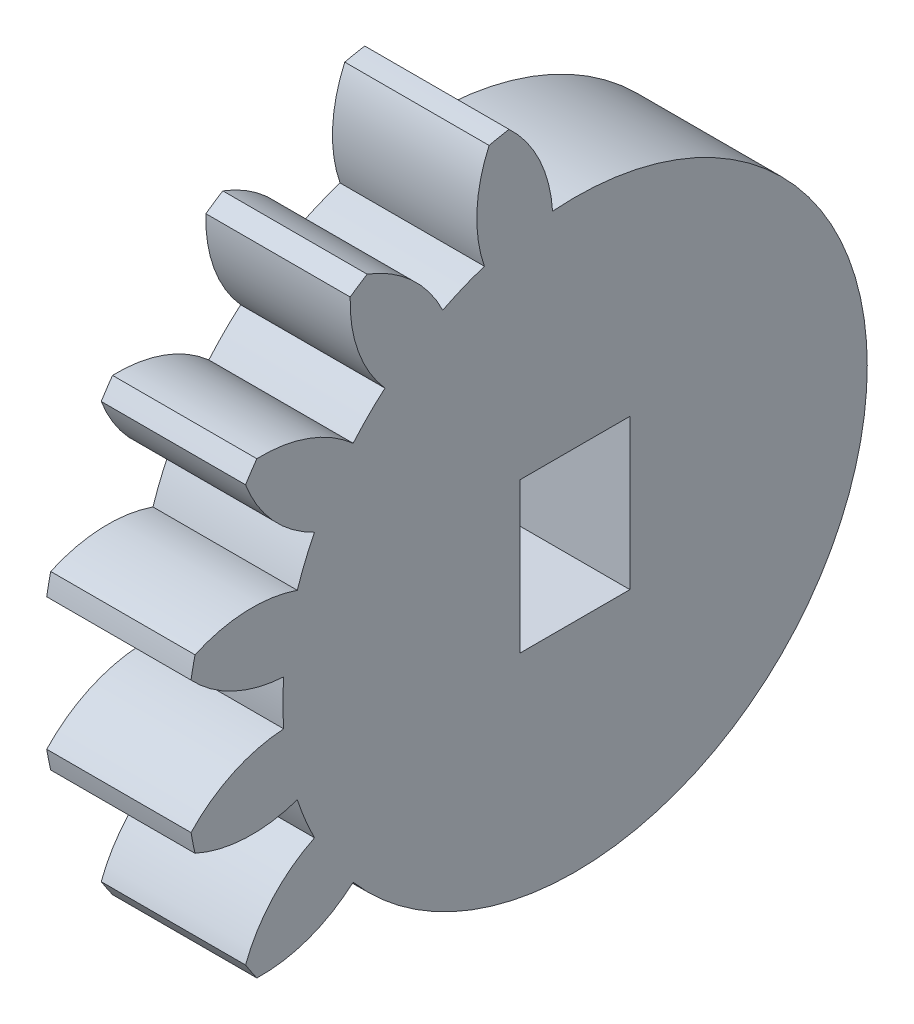
ISO-10303-21;
HEADER;
FILE_DESCRIPTION(('STEP AP214'),'2;1');
FILE_NAME('part.step','',(''),(''),'','','');
FILE_SCHEMA(('AUTOMOTIVE_DESIGN { 1 0 10303 214 1 1 1 1 }'));
ENDSEC;
DATA;
#1=APPLICATION_CONTEXT('core data for automotive mechanical design processes');
#2=APPLICATION_PROTOCOL_DEFINITION('international standard','automotive_design',2000,#1);
#3=PRODUCT_CONTEXT('',#1,'mechanical');
#4=PRODUCT('Part','Part','',(#3));
#5=PRODUCT_RELATED_PRODUCT_CATEGORY('part','',(#4));
#6=PRODUCT_DEFINITION_FORMATION('','',#4);
#7=PRODUCT_DEFINITION_CONTEXT('part definition',#1,'design');
#8=PRODUCT_DEFINITION('design','',#6,#7);
#9=PRODUCT_DEFINITION_SHAPE('','',#8);
#10=(LENGTH_UNIT() NAMED_UNIT(*) SI_UNIT(.MILLI.,.METRE.));
#11=(NAMED_UNIT(*) PLANE_ANGLE_UNIT() SI_UNIT($,.RADIAN.));
#12=(NAMED_UNIT(*) SI_UNIT($,.STERADIAN.) SOLID_ANGLE_UNIT());
#13=UNCERTAINTY_MEASURE_WITH_UNIT(LENGTH_MEASURE(1.E-05),#10,'distance_accuracy_value','');
#14=(GEOMETRIC_REPRESENTATION_CONTEXT(3) GLOBAL_UNCERTAINTY_ASSIGNED_CONTEXT((#13)) GLOBAL_UNIT_ASSIGNED_CONTEXT((#10,
#11,#12)) REPRESENTATION_CONTEXT('',''));
#15=CARTESIAN_POINT('',(0.,0.,0.));
#16=DIRECTION('',(0.,0.,1.));
#17=DIRECTION('',(1.,0.,0.));
#18=AXIS2_PLACEMENT_3D('',#15,#16,#17);
#19=CARTESIAN_POINT('',(5.321340974549,-0.103732331280391,-1.32233101095381));
#20=DIRECTION('',(-1.,0.,0.));
#21=DIRECTION('',(0.,0.,1.));
#22=AXIS2_PLACEMENT_3D('',#19,#20,#21);
#23=PLANE('',#22);
#24=CARTESIAN_POINT('',(5.321340974549,-3.09689234003466,9.5494762492653));
#25=DIRECTION('',(-1.,0.,0.));
#26=DIRECTION('',(0.,0.707106781186544,0.707106781186551));
#27=AXIS2_PLACEMENT_3D('',#24,#25,#26);
#28=CIRCLE('',#27,4.7999999999976);
#29=CARTESIAN_POINT('',(5.321340974549,-6.68980607511171,6.36655763700522));
#30=VERTEX_POINT('',#29);
#31=CARTESIAN_POINT('',(5.321340974549,-7.8944409978245,9.70286098160815));
#32=VERTEX_POINT('',#31);
#33=EDGE_CURVE('E311',#30,#32,#28,.T.);
#34=ORIENTED_EDGE('',*,*,#33,.F.);
#35=CARTESIAN_POINT('',(5.321340974549,-0.103732331280391,-1.32233101095381));
#36=DIRECTION('',(-1.,0.,0.));
#37=DIRECTION('',(0.,0.,-1.));
#38=AXIS2_PLACEMENT_3D('',#35,#36,#37);
#39=CIRCLE('',#38,10.1239999999949);
#40=CARTESIAN_POINT('',(5.321340974549,9.9901903771375,-0.542523113851461));
#41=VERTEX_POINT('',#40);
#42=EDGE_CURVE('E376',#41,#30,#39,.T.);
#43=ORIENTED_EDGE('',*,*,#42,.F.);
#44=CARTESIAN_POINT('',(5.321340974549,9.70028004554018,4.24871388713379));
#45=DIRECTION('',(-1.,0.,0.));
#46=DIRECTION('',(0.,0.,-1.));
#47=AXIS2_PLACEMENT_3D('',#44,#45,#46);
#48=CIRCLE('',#47,4.7999999999976);
#49=CARTESIAN_POINT('',(5.321340974549,13.2011186189059,0.964794082508302));
#50=VERTEX_POINT('',#49);
#51=EDGE_CURVE('E374',#50,#41,#48,.T.);
#52=ORIENTED_EDGE('',*,*,#51,.F.);
#53=CARTESIAN_POINT('',(5.321340974549,-0.103732331280391,-1.32233101095381));
#54=DIRECTION('',(-1.,0.,0.));
#55=DIRECTION('',(0.,0.,1.));
#56=AXIS2_PLACEMENT_3D('',#53,#54,#55);
#57=CIRCLE('',#56,13.4999999999932);
#58=CARTESIAN_POINT('',(5.321340974549,13.0635920257245,1.65618695562682));
#59=VERTEX_POINT('',#58);
#60=EDGE_CURVE('E391',#59,#50,#57,.T.);
#61=ORIENTED_EDGE('',*,*,#60,.F.);
#62=CARTESIAN_POINT('',(5.321340974549,11.0859406236117,-2.71747225968684));
#63=DIRECTION('',(-1.,0.,0.));
#64=DIRECTION('',(0.,0.382683432365091,-0.923879532511287));
#65=AXIS2_PLACEMENT_3D('',#62,#63,#64);
#66=CIRCLE('',#65,4.7999999999976);
#67=CARTESIAN_POINT('',(5.321340974549,9.52025582442632,1.81999742170795));
#68=VERTEX_POINT('',#67);
#69=EDGE_CURVE('E352',#68,#59,#66,.T.);
#70=ORIENTED_EDGE('',*,*,#69,.F.);
#71=CARTESIAN_POINT('',(5.321340974549,-0.103732331280391,-1.32233101095381));
#72=DIRECTION('',(-1.,0.,0.));
#73=DIRECTION('',(0.,0.382683432365091,-0.923879532511287));
#74=AXIS2_PLACEMENT_3D('',#71,#72,#73);
#75=CIRCLE('',#74,10.1239999999949);
#76=CARTESIAN_POINT('',(5.321340974549,8.92341669912926,3.26089453255501));
#77=VERTEX_POINT('',#76);
#78=EDGE_CURVE('E357',#77,#68,#75,.T.);
#79=ORIENTED_EDGE('',*,*,#78,.F.);
#80=CARTESIAN_POINT('',(5.321340974549,6.82204745669128,7.57647645240227));
#81=DIRECTION('',(-1.,0.,0.));
#82=DIRECTION('',(0.,0.382683432365091,-0.923879532511287));
#83=AXIS2_PLACEMENT_3D('',#80,#81,#82);
#84=CIRCLE('',#83,4.7999999999976);
#85=CARTESIAN_POINT('',(5.321340974549,11.3131022636957,5.88224307991203));
#86=VERTEX_POINT('',#85);
#87=EDGE_CURVE('E354',#86,#77,#84,.T.);
#88=ORIENTED_EDGE('',*,*,#87,.F.);
#89=CARTESIAN_POINT('',(5.321340974549,10.9214596612816,6.46837765559026));
#90=VERTEX_POINT('',#89);
#91=EDGE_CURVE('E388',#90,#86,#57,.T.);
#92=ORIENTED_EDGE('',*,*,#91,.F.);
#93=CARTESIAN_POINT('',(5.321340974549,10.7680749289387,1.67082899780042));
#94=DIRECTION('',(-1.,0.,0.));
#95=DIRECTION('',(0.,0.707106781186549,-0.707106781186546));
#96=AXIS2_PLACEMENT_3D('',#93,#94,#95);
#97=CIRCLE('',#96,4.7999999999976);
#98=CARTESIAN_POINT('',(5.321340974549,7.58515631667866,5.26374273287748));
#99=VERTEX_POINT('',#98);
#100=EDGE_CURVE('E294',#99,#90,#97,.T.);
#101=ORIENTED_EDGE('',*,*,#100,.F.);
#102=CARTESIAN_POINT('',(5.321340974549,-0.103732331280391,-1.32233101095381));
#103=DIRECTION('',(-1.,0.,0.));
#104=DIRECTION('',(0.,0.707106781186549,-0.707106781186546));
#105=AXIS2_PLACEMENT_3D('',#102,#103,#104);
#106=CIRCLE('',#105,10.1239999999949);
#107=CARTESIAN_POINT('',(5.321340974549,6.48234141255087,6.36655763700527));
#108=VERTEX_POINT('',#107);
#109=EDGE_CURVE('E299',#108,#99,#106,.T.);
#110=ORIENTED_EDGE('',*,*,#109,.F.);
#111=CARTESIAN_POINT('',(5.321340974549,2.8894276774738,9.54947624926532));
#112=DIRECTION('',(-1.,0.,0.));
#113=DIRECTION('',(0.,0.707106781186549,-0.707106781186546));
#114=AXIS2_PLACEMENT_3D('',#111,#112,#113);
#115=CIRCLE('',#114,4.7999999999976);
#116=CARTESIAN_POINT('',(5.321340974549,7.68697633526364,9.7028609816082));
#117=VERTEX_POINT('',#116);
#118=EDGE_CURVE('E296',#117,#108,#115,.T.);
#119=ORIENTED_EDGE('',*,*,#118,.F.);
#120=CARTESIAN_POINT('',(5.321340974549,7.10084175958541,10.0945035840223));
#121=VERTEX_POINT('',#120);
#122=EDGE_CURVE('E390',#121,#117,#57,.T.);
#123=ORIENTED_EDGE('',*,*,#122,.F.);
#124=CARTESIAN_POINT('',(5.321340974549,8.79507513207567,5.60344877701789));
#125=DIRECTION('',(-1.,0.,0.));
#126=DIRECTION('',(0.,0.923879532511288,-0.382683432365087));
#127=AXIS2_PLACEMENT_3D('',#124,#125,#126);
#128=CIRCLE('',#127,4.7999999999976);
#129=CARTESIAN_POINT('',(5.321340974549,4.47949321222839,7.70481801945585));
#130=VERTEX_POINT('',#129);
#131=EDGE_CURVE('E258',#130,#121,#128,.T.);
#132=ORIENTED_EDGE('',*,*,#131,.F.);
#133=CARTESIAN_POINT('',(5.321340974549,-0.103732331280391,-1.32233101095381));
#134=DIRECTION('',(-1.,0.,0.));
#135=DIRECTION('',(0.,0.923879532511288,-0.382683432365087));
#136=AXIS2_PLACEMENT_3D('',#133,#134,#135);
#137=CIRCLE('',#136,10.1239999999949);
#138=CARTESIAN_POINT('',(5.321340974549,3.03859610138134,8.30165714475291));
#139=VERTEX_POINT('',#138);
#140=EDGE_CURVE('E263',#139,#130,#137,.T.);
#141=ORIENTED_EDGE('',*,*,#140,.F.);
#142=CARTESIAN_POINT('',(5.321340974549,-1.49887358001346,9.86734194393823));
#143=DIRECTION('',(-1.,0.,0.));
#144=DIRECTION('',(0.,0.923879532511288,-0.382683432365087));
#145=AXIS2_PLACEMENT_3D('',#142,#143,#144);
#146=CIRCLE('',#145,4.7999999999976);
#147=CARTESIAN_POINT('',(5.321340974549,2.87478563530019,11.8449933460511));
#148=VERTEX_POINT('',#147);
#149=EDGE_CURVE('E260',#148,#139,#146,.T.);
#150=ORIENTED_EDGE('',*,*,#149,.F.);
#151=CARTESIAN_POINT('',(5.321340974549,2.18339276218168,11.9825199392325));
#152=VERTEX_POINT('',#151);
#153=EDGE_CURVE('E418',#152,#148,#57,.T.);
#154=ORIENTED_EDGE('',*,*,#153,.F.);
#155=CARTESIAN_POINT('',(5.321340974549,5.46731256680717,8.48168136586678));
#156=DIRECTION('',(-1.,0.,0.));
#157=DIRECTION('',(0.,1.,0.));
#158=AXIS2_PLACEMENT_3D('',#155,#156,#157);
#159=CIRCLE('',#158,4.7999999999976);
#160=CARTESIAN_POINT('',(5.321340974549,0.676075565821922,8.77159169746408));
#161=VERTEX_POINT('',#160);
#162=EDGE_CURVE('E277',#161,#152,#159,.T.);
#163=ORIENTED_EDGE('',*,*,#162,.F.);
#164=CARTESIAN_POINT('',(5.321340974549,-0.103732331280391,-1.32233101095381));
#165=DIRECTION('',(-1.,0.,0.));
#166=DIRECTION('',(0.,1.,0.));
#167=AXIS2_PLACEMENT_3D('',#164,#165,#166);
#168=CIRCLE('',#167,10.1239999999949);
#169=CARTESIAN_POINT('',(5.321340974549,-0.883540228382775,8.77159169746407));
#170=VERTEX_POINT('',#169);
#171=EDGE_CURVE('E282',#170,#161,#168,.T.);
#172=ORIENTED_EDGE('',*,*,#171,.F.);
#173=CARTESIAN_POINT('',(5.321340974549,-5.67477722936802,8.48168136586674));
#174=DIRECTION('',(-1.,0.,0.));
#175=DIRECTION('',(0.,1.,0.));
#176=AXIS2_PLACEMENT_3D('',#173,#174,#175);
#177=CIRCLE('',#176,4.7999999999976);
#178=CARTESIAN_POINT('',(5.321340974549,-2.39085742474255,11.9825199392325));
#179=VERTEX_POINT('',#178);
#180=EDGE_CURVE('E279',#179,#170,#177,.T.);
#181=ORIENTED_EDGE('',*,*,#180,.F.);
#182=CARTESIAN_POINT('',(5.321340974549,-3.08225029786107,11.8449933460511));
#183=VERTEX_POINT('',#182);
#184=EDGE_CURVE('E477',#183,#179,#57,.T.);
#185=ORIENTED_EDGE('',*,*,#184,.F.);
#186=CARTESIAN_POINT('',(5.321340974549,1.2914089174526,9.86734194393824));
#187=DIRECTION('',(-1.,0.,0.));
#188=DIRECTION('',(0.,0.923879532511285,0.382683432365094));
#189=AXIS2_PLACEMENT_3D('',#186,#187,#188);
#190=CIRCLE('',#189,4.7999999999976);
#191=CARTESIAN_POINT('',(5.321340974549,-3.24606076394219,8.30165714475289));
#192=VERTEX_POINT('',#191);
#193=EDGE_CURVE('E319',#192,#183,#190,.T.);
#194=ORIENTED_EDGE('',*,*,#193,.F.);
#195=CARTESIAN_POINT('',(5.321340974549,-0.103732331280391,-1.32233101095381));
#196=DIRECTION('',(-1.,0.,0.));
#197=DIRECTION('',(0.,0.923879532511285,0.382683432365094));
#198=AXIS2_PLACEMENT_3D('',#195,#196,#197);
#199=CIRCLE('',#198,10.1239999999949);
#200=CARTESIAN_POINT('',(5.321340974549,-4.68695787478924,7.70481801945582));
#201=VERTEX_POINT('',#200);
#202=EDGE_CURVE('E324',#201,#192,#199,.T.);
#203=ORIENTED_EDGE('',*,*,#202,.F.);
#204=CARTESIAN_POINT('',(5.321340974549,-9.0025397946365,5.60344877701783));
#205=DIRECTION('',(-1.,0.,0.));
#206=DIRECTION('',(0.,0.923879532511285,0.382683432365094));
#207=AXIS2_PLACEMENT_3D('',#204,#205,#206);
#208=CIRCLE('',#207,4.7999999999976);
#209=CARTESIAN_POINT('',(5.321340974549,-7.30830642214627,10.0945035840222));
#210=VERTEX_POINT('',#209);
#211=EDGE_CURVE('E321',#210,#201,#208,.T.);
#212=ORIENTED_EDGE('',*,*,#211,.F.);
#213=EDGE_CURVE('E396',#32,#210,#57,.T.);
#214=ORIENTED_EDGE('',*,*,#213,.F.);
#215=EDGE_LOOP('',(#34,#43,#52,#61,#70,#79,#88,#92,#101,#110,#119,#123,#132,#141,#150,#154,#163,
#172,#181,#185,#194,#203,#212,#214));
#216=FACE_BOUND('',#215,.T.);
#217=DIRECTION('',(0.,-1.,0.));
#218=VECTOR('',#217,1.);
#219=CARTESIAN_POINT('',(5.321340974549,0.,-3.22233101095381));
#220=LINE('',#219,#218);
#221=CARTESIAN_POINT('',(5.321340974549,2.49626766871961,-3.22233101095381));
#222=VERTEX_POINT('',#221);
#223=CARTESIAN_POINT('',(5.321340974549,-2.70373233128039,-3.22233101095381));
#224=VERTEX_POINT('',#223);
#225=EDGE_CURVE('E52',#222,#224,#220,.T.);
#226=ORIENTED_EDGE('',*,*,#225,.T.);
#227=DIRECTION('',(0.,0.,1.));
#228=VECTOR('',#227,1.);
#229=CARTESIAN_POINT('',(5.321340974549,-2.70373233128039,0.));
#230=LINE('',#229,#228);
#231=CARTESIAN_POINT('',(5.321340974549,-2.70373233128039,0.57766898904619));
#232=VERTEX_POINT('',#231);
#233=EDGE_CURVE('E239',#224,#232,#230,.T.);
#234=ORIENTED_EDGE('',*,*,#233,.T.);
#235=DIRECTION('',(0.,-1.,0.));
#236=VECTOR('',#235,1.);
#237=CARTESIAN_POINT('',(5.321340974549,0.,0.57766898904619));
#238=LINE('',#237,#236);
#239=CARTESIAN_POINT('',(5.321340974549,2.49626766871961,0.57766898904619));
#240=VERTEX_POINT('',#239);
#241=EDGE_CURVE('E242',#240,#232,#238,.T.);
#242=ORIENTED_EDGE('',*,*,#241,.F.);
#243=DIRECTION('',(0.,0.,1.));
#244=VECTOR('',#243,1.);
#245=CARTESIAN_POINT('',(5.321340974549,2.49626766871961,0.));
#246=LINE('',#245,#244);
#247=EDGE_CURVE('E248',#222,#240,#246,.T.);
#248=ORIENTED_EDGE('',*,*,#247,.F.);
#249=EDGE_LOOP('',(#226,#234,#242,#248));
#250=FACE_BOUND('',#249,.T.);
#251=ADVANCED_FACE('F38',(#216,#250),#23,.F.);
#252=CARTESIAN_POINT('',(0.321340974549003,-0.103732331280391,-1.32233101095381));
#253=DIRECTION('',(1.,0.,0.));
#254=DIRECTION('',(0.,0.,-1.));
#255=AXIS2_PLACEMENT_3D('',#252,#253,#254);
#256=PLANE('',#255);
#257=CARTESIAN_POINT('',(0.321340974549003,-0.103732331280391,-1.32233101095381));
#258=DIRECTION('',(-1.,0.,0.));
#259=DIRECTION('',(0.,0.,-1.));
#260=AXIS2_PLACEMENT_3D('',#257,#258,#259);
#261=CIRCLE('',#260,10.1239999999949);
#262=CARTESIAN_POINT('',(0.321340974549003,9.9901903771375,-0.542523113851461));
#263=VERTEX_POINT('',#262);
#264=CARTESIAN_POINT('',(0.321340974549003,-6.68980607511171,6.36655763700522));
#265=VERTEX_POINT('',#264);
#266=EDGE_CURVE('E373',#263,#265,#261,.T.);
#267=ORIENTED_EDGE('',*,*,#266,.T.);
#268=CARTESIAN_POINT('',(0.321340974549003,-3.09689234003466,9.5494762492653));
#269=DIRECTION('',(-1.,0.,0.));
#270=DIRECTION('',(0.,0.707106781186544,0.707106781186551));
#271=AXIS2_PLACEMENT_3D('',#268,#269,#270);
#272=CIRCLE('',#271,4.7999999999976);
#273=CARTESIAN_POINT('',(0.321340974549003,-7.8944409978245,9.70286098160815));
#274=VERTEX_POINT('',#273);
#275=EDGE_CURVE('E254',#265,#274,#272,.T.);
#276=ORIENTED_EDGE('',*,*,#275,.T.);
#277=CARTESIAN_POINT('',(0.321340974549003,-0.103732331280391,-1.32233101095381));
#278=DIRECTION('',(-1.,0.,0.));
#279=DIRECTION('',(0.,0.,1.));
#280=AXIS2_PLACEMENT_3D('',#277,#278,#279);
#281=CIRCLE('',#280,13.4999999999932);
#282=CARTESIAN_POINT('',(0.321340974549003,-7.30830642214627,10.0945035840222));
#283=VERTEX_POINT('',#282);
#284=EDGE_CURVE('E421',#274,#283,#281,.T.);
#285=ORIENTED_EDGE('',*,*,#284,.T.);
#286=CARTESIAN_POINT('',(0.321340974549003,-9.0025397946365,5.60344877701783));
#287=DIRECTION('',(1.,0.,0.));
#288=DIRECTION('',(0.,0.,-1.));
#289=AXIS2_PLACEMENT_3D('',#286,#287,#288);
#290=CIRCLE('',#289,4.7999999999976);
#291=CARTESIAN_POINT('',(0.321340974549003,-4.68695787478924,7.70481801945582));
#292=VERTEX_POINT('',#291);
#293=EDGE_CURVE('E399',#292,#283,#290,.T.);
#294=ORIENTED_EDGE('',*,*,#293,.F.);
#295=CARTESIAN_POINT('',(0.321340974549003,-0.103732331280391,-1.32233101095381));
#296=DIRECTION('',(-1.,0.,0.));
#297=DIRECTION('',(0.,0.923879532511285,0.382683432365094));
#298=AXIS2_PLACEMENT_3D('',#295,#296,#297);
#299=CIRCLE('',#298,10.1239999999949);
#300=CARTESIAN_POINT('',(0.321340974549003,-3.24606076394219,8.30165714475288));
#301=VERTEX_POINT('',#300);
#302=EDGE_CURVE('E322',#292,#301,#299,.T.);
#303=ORIENTED_EDGE('',*,*,#302,.T.);
#304=CARTESIAN_POINT('',(0.321340974549003,1.2914089174526,9.86734194393824));
#305=DIRECTION('',(-1.,0.,0.));
#306=DIRECTION('',(0.,0.923879532511285,0.382683432365094));
#307=AXIS2_PLACEMENT_3D('',#304,#305,#306);
#308=CIRCLE('',#307,4.7999999999976);
#309=CARTESIAN_POINT('',(0.321340974549003,-3.08225029786107,11.8449933460511));
#310=VERTEX_POINT('',#309);
#311=EDGE_CURVE('E318',#301,#310,#308,.T.);
#312=ORIENTED_EDGE('',*,*,#311,.T.);
#313=CARTESIAN_POINT('',(0.321340974549003,-2.39085742474255,11.9825199392325));
#314=VERTEX_POINT('',#313);
#315=EDGE_CURVE('E419',#310,#314,#281,.T.);
#316=ORIENTED_EDGE('',*,*,#315,.T.);
#317=CARTESIAN_POINT('',(0.321340974549003,-5.67477722936802,8.48168136586674));
#318=DIRECTION('',(1.,0.,0.));
#319=DIRECTION('',(0.,0.,-1.));
#320=AXIS2_PLACEMENT_3D('',#317,#318,#319);
#321=CIRCLE('',#320,4.7999999999976);
#322=CARTESIAN_POINT('',(0.321340974549003,-0.883540228382775,8.77159169746407));
#323=VERTEX_POINT('',#322);
#324=EDGE_CURVE('E11',#323,#314,#321,.T.);
#325=ORIENTED_EDGE('',*,*,#324,.F.);
#326=CARTESIAN_POINT('',(0.321340974549003,-0.103732331280391,-1.32233101095381));
#327=DIRECTION('',(-1.,0.,0.));
#328=DIRECTION('',(0.,1.,0.));
#329=AXIS2_PLACEMENT_3D('',#326,#327,#328);
#330=CIRCLE('',#329,10.1239999999949);
#331=CARTESIAN_POINT('',(0.321340974549003,0.676075565821922,8.77159169746408));
#332=VERTEX_POINT('',#331);
#333=EDGE_CURVE('E280',#323,#332,#330,.T.);
#334=ORIENTED_EDGE('',*,*,#333,.T.);
#335=CARTESIAN_POINT('',(0.321340974549003,5.46731256680717,8.48168136586678));
#336=DIRECTION('',(-1.,0.,0.));
#337=DIRECTION('',(0.,1.,0.));
#338=AXIS2_PLACEMENT_3D('',#335,#336,#337);
#339=CIRCLE('',#338,4.7999999999976);
#340=CARTESIAN_POINT('',(0.321340974549003,2.18339276218168,11.9825199392325));
#341=VERTEX_POINT('',#340);
#342=EDGE_CURVE('E285',#332,#341,#339,.T.);
#343=ORIENTED_EDGE('',*,*,#342,.T.);
#344=CARTESIAN_POINT('',(0.321340974549003,2.87478563530019,11.8449933460511));
#345=VERTEX_POINT('',#344);
#346=EDGE_CURVE('E416',#341,#345,#281,.T.);
#347=ORIENTED_EDGE('',*,*,#346,.T.);
#348=CARTESIAN_POINT('',(0.321340974549003,-1.49887358001346,9.86734194393823));
#349=DIRECTION('',(1.,0.,0.));
#350=DIRECTION('',(0.,0.,-1.));
#351=AXIS2_PLACEMENT_3D('',#348,#349,#350);
#352=CIRCLE('',#351,4.7999999999976);
#353=CARTESIAN_POINT('',(0.321340974549003,3.03859610138134,8.30165714475291));
#354=VERTEX_POINT('',#353);
#355=EDGE_CURVE('E45',#354,#345,#352,.T.);
#356=ORIENTED_EDGE('',*,*,#355,.F.);
#357=CARTESIAN_POINT('',(0.321340974549003,-0.103732331280391,-1.32233101095381));
#358=DIRECTION('',(-1.,0.,0.));
#359=DIRECTION('',(0.,0.923879532511288,-0.382683432365087));
#360=AXIS2_PLACEMENT_3D('',#357,#358,#359);
#361=CIRCLE('',#360,10.1239999999949);
#362=CARTESIAN_POINT('',(0.321340974549003,4.47949321222839,7.70481801945585));
#363=VERTEX_POINT('',#362);
#364=EDGE_CURVE('E261',#354,#363,#361,.T.);
#365=ORIENTED_EDGE('',*,*,#364,.T.);
#366=CARTESIAN_POINT('',(0.321340974549003,8.79507513207567,5.60344877701789));
#367=DIRECTION('',(-1.,0.,0.));
#368=DIRECTION('',(0.,0.923879532511288,-0.382683432365087));
#369=AXIS2_PLACEMENT_3D('',#366,#367,#368);
#370=CIRCLE('',#369,4.7999999999976);
#371=CARTESIAN_POINT('',(0.321340974549003,7.10084175958541,10.0945035840223));
#372=VERTEX_POINT('',#371);
#373=EDGE_CURVE('E266',#363,#372,#370,.T.);
#374=ORIENTED_EDGE('',*,*,#373,.T.);
#375=CARTESIAN_POINT('',(0.321340974549003,7.68697633526364,9.7028609816082));
#376=VERTEX_POINT('',#375);
#377=EDGE_CURVE('E387',#372,#376,#281,.T.);
#378=ORIENTED_EDGE('',*,*,#377,.T.);
#379=CARTESIAN_POINT('',(0.321340974549003,2.8894276774738,9.54947624926532));
#380=DIRECTION('',(1.,0.,0.));
#381=DIRECTION('',(0.,0.,-1.));
#382=AXIS2_PLACEMENT_3D('',#379,#380,#381);
#383=CIRCLE('',#382,4.7999999999976);
#384=CARTESIAN_POINT('',(0.321340974549003,6.48234141255087,6.36655763700527));
#385=VERTEX_POINT('',#384);
#386=EDGE_CURVE('E401',#385,#376,#383,.T.);
#387=ORIENTED_EDGE('',*,*,#386,.F.);
#388=CARTESIAN_POINT('',(0.321340974549003,-0.103732331280391,-1.32233101095381));
#389=DIRECTION('',(-1.,0.,0.));
#390=DIRECTION('',(0.,0.707106781186549,-0.707106781186546));
#391=AXIS2_PLACEMENT_3D('',#388,#389,#390);
#392=CIRCLE('',#391,10.1239999999949);
#393=CARTESIAN_POINT('',(0.321340974549003,7.58515631667866,5.26374273287748));
#394=VERTEX_POINT('',#393);
#395=EDGE_CURVE('E297',#385,#394,#392,.T.);
#396=ORIENTED_EDGE('',*,*,#395,.T.);
#397=CARTESIAN_POINT('',(0.321340974549003,10.7680749289387,1.67082899780042));
#398=DIRECTION('',(-1.,0.,0.));
#399=DIRECTION('',(0.,0.707106781186549,-0.707106781186546));
#400=AXIS2_PLACEMENT_3D('',#397,#398,#399);
#401=CIRCLE('',#400,4.7999999999976);
#402=CARTESIAN_POINT('',(0.321340974549003,10.9214596612816,6.46837765559026));
#403=VERTEX_POINT('',#402);
#404=EDGE_CURVE('E276',#394,#403,#401,.T.);
#405=ORIENTED_EDGE('',*,*,#404,.T.);
#406=CARTESIAN_POINT('',(0.321340974549003,11.3131022636957,5.88224307991203));
#407=VERTEX_POINT('',#406);
#408=EDGE_CURVE('E385',#403,#407,#281,.T.);
#409=ORIENTED_EDGE('',*,*,#408,.T.);
#410=CARTESIAN_POINT('',(0.321340974549003,6.82204745669128,7.57647645240227));
#411=DIRECTION('',(1.,0.,0.));
#412=DIRECTION('',(0.,0.,-1.));
#413=AXIS2_PLACEMENT_3D('',#410,#411,#412);
#414=CIRCLE('',#413,4.7999999999976);
#415=CARTESIAN_POINT('',(0.321340974549003,8.92341669912926,3.26089453255501));
#416=VERTEX_POINT('',#415);
#417=EDGE_CURVE('E395',#416,#407,#414,.T.);
#418=ORIENTED_EDGE('',*,*,#417,.F.);
#419=CARTESIAN_POINT('',(0.321340974549003,-0.103732331280391,-1.32233101095381));
#420=DIRECTION('',(-1.,0.,0.));
#421=DIRECTION('',(0.,0.382683432365091,-0.923879532511287));
#422=AXIS2_PLACEMENT_3D('',#419,#420,#421);
#423=CIRCLE('',#422,10.1239999999949);
#424=CARTESIAN_POINT('',(0.321340974549003,9.52025582442632,1.81999742170795));
#425=VERTEX_POINT('',#424);
#426=EDGE_CURVE('E355',#416,#425,#423,.T.);
#427=ORIENTED_EDGE('',*,*,#426,.T.);
#428=CARTESIAN_POINT('',(0.321340974549003,11.0859406236117,-2.71747225968684));
#429=DIRECTION('',(-1.,0.,0.));
#430=DIRECTION('',(0.,0.382683432365091,-0.923879532511287));
#431=AXIS2_PLACEMENT_3D('',#428,#429,#430);
#432=CIRCLE('',#431,4.7999999999976);
#433=CARTESIAN_POINT('',(0.321340974549003,13.0635920257245,1.65618695562682));
#434=VERTEX_POINT('',#433);
#435=EDGE_CURVE('E351',#425,#434,#432,.T.);
#436=ORIENTED_EDGE('',*,*,#435,.T.);
#437=CARTESIAN_POINT('',(0.321340974549003,13.2011186189059,0.964794082508301));
#438=VERTEX_POINT('',#437);
#439=EDGE_CURVE('E384',#434,#438,#281,.T.);
#440=ORIENTED_EDGE('',*,*,#439,.T.);
#441=CARTESIAN_POINT('',(0.321340974549003,9.70028004554018,4.24871388713379));
#442=DIRECTION('',(1.,0.,0.));
#443=DIRECTION('',(0.,0.,-1.));
#444=AXIS2_PLACEMENT_3D('',#441,#442,#443);
#445=CIRCLE('',#444,4.7999999999976);
#446=EDGE_CURVE('E392',#263,#438,#445,.T.);
#447=ORIENTED_EDGE('',*,*,#446,.F.);
#448=EDGE_LOOP('',(#267,#276,#285,#294,#303,#312,#316,#325,#334,#343,#347,#356,#365,#374,#378,
#387,#396,#405,#409,#418,#427,#436,#440,#447));
#449=FACE_BOUND('',#448,.T.);
#450=DIRECTION('',(0.,-1.,0.));
#451=VECTOR('',#450,1.);
#452=CARTESIAN_POINT('',(0.321340974549003,0.,-3.22233101095381));
#453=LINE('',#452,#451);
#454=CARTESIAN_POINT('',(0.321340974549003,2.49626766871961,-3.22233101095381));
#455=VERTEX_POINT('',#454);
#456=CARTESIAN_POINT('',(0.321340974549003,-2.70373233128039,-3.22233101095381));
#457=VERTEX_POINT('',#456);
#458=EDGE_CURVE('E224',#455,#457,#453,.T.);
#459=ORIENTED_EDGE('',*,*,#458,.F.);
#460=DIRECTION('',(0.,0.,1.));
#461=VECTOR('',#460,1.);
#462=CARTESIAN_POINT('',(0.321340974549003,2.49626766871961,0.));
#463=LINE('',#462,#461);
#464=CARTESIAN_POINT('',(0.321340974549003,2.49626766871961,0.57766898904619));
#465=VERTEX_POINT('',#464);
#466=EDGE_CURVE('E233',#455,#465,#463,.T.);
#467=ORIENTED_EDGE('',*,*,#466,.T.);
#468=DIRECTION('',(0.,-1.,0.));
#469=VECTOR('',#468,1.);
#470=CARTESIAN_POINT('',(0.321340974549003,0.,0.57766898904619));
#471=LINE('',#470,#469);
#472=CARTESIAN_POINT('',(0.321340974549003,-2.70373233128039,0.57766898904619));
#473=VERTEX_POINT('',#472);
#474=EDGE_CURVE('E60',#465,#473,#471,.T.);
#475=ORIENTED_EDGE('',*,*,#474,.T.);
#476=DIRECTION('',(0.,0.,1.));
#477=VECTOR('',#476,1.);
#478=CARTESIAN_POINT('',(0.321340974549003,-2.70373233128039,0.));
#479=LINE('',#478,#477);
#480=EDGE_CURVE('E230',#457,#473,#479,.T.);
#481=ORIENTED_EDGE('',*,*,#480,.F.);
#482=EDGE_LOOP('',(#459,#467,#475,#481));
#483=FACE_BOUND('',#482,.T.);
#484=ADVANCED_FACE('F238',(#449,#483),#256,.F.);
#485=CARTESIAN_POINT('',(-9.678659025451,-0.103732331280391,-1.32233101095381));
#486=DIRECTION('',(-1.,0.,0.));
#487=DIRECTION('',(0.,0.,1.));
#488=AXIS2_PLACEMENT_3D('',#485,#486,#487);
#489=CYLINDRICAL_SURFACE('',#488,13.4999999999932);
#490=DIRECTION('',(-1.,0.,0.));
#491=VECTOR('',#490,1.);
#492=CARTESIAN_POINT('',(2.821340974549,2.18339276218168,11.9825199392325));
#493=LINE('',#492,#491);
#494=EDGE_CURVE('E349',#152,#341,#493,.T.);
#495=ORIENTED_EDGE('',*,*,#494,.F.);
#496=ORIENTED_EDGE('',*,*,#153,.T.);
#497=DIRECTION('',(-1.,0.,0.));
#498=VECTOR('',#497,1.);
#499=CARTESIAN_POINT('',(2.821340974549,2.87478563530019,11.8449933460511));
#500=LINE('',#499,#498);
#501=EDGE_CURVE('E343',#345,#148,#500,.F.);
#502=ORIENTED_EDGE('',*,*,#501,.F.);
#503=ORIENTED_EDGE('',*,*,#346,.F.);
#504=EDGE_LOOP('',(#495,#496,#502,#503));
#505=FACE_BOUND('',#504,.T.);
#506=ADVANCED_FACE('F415',(#505),#489,.T.);
#507=DIRECTION('',(-1.,0.,0.));
#508=VECTOR('',#507,1.);
#509=CARTESIAN_POINT('',(2.821340974549,-2.39085742474255,11.9825199392325));
#510=LINE('',#509,#508);
#511=EDGE_CURVE('E347',#314,#179,#510,.F.);
#512=ORIENTED_EDGE('',*,*,#511,.F.);
#513=ORIENTED_EDGE('',*,*,#315,.F.);
#514=DIRECTION('',(-1.,0.,0.));
#515=VECTOR('',#514,1.);
#516=CARTESIAN_POINT('',(2.821340974549,-3.08225029786107,11.8449933460511));
#517=LINE('',#516,#515);
#518=EDGE_CURVE('E337',#183,#310,#517,.T.);
#519=ORIENTED_EDGE('',*,*,#518,.F.);
#520=ORIENTED_EDGE('',*,*,#184,.T.);
#521=EDGE_LOOP('',(#512,#513,#519,#520));
#522=FACE_BOUND('',#521,.T.);
#523=ADVANCED_FACE('F487',(#522),#489,.T.);
#524=DIRECTION('',(-1.,0.,0.));
#525=VECTOR('',#524,1.);
#526=CARTESIAN_POINT('',(2.821340974549,7.10084175958541,10.0945035840223));
#527=LINE('',#526,#525);
#528=EDGE_CURVE('E345',#121,#372,#527,.T.);
#529=ORIENTED_EDGE('',*,*,#528,.F.);
#530=ORIENTED_EDGE('',*,*,#122,.T.);
#531=DIRECTION('',(-1.,0.,0.));
#532=VECTOR('',#531,1.);
#533=CARTESIAN_POINT('',(2.821340974549,7.68697633526364,9.7028609816082));
#534=LINE('',#533,#532);
#535=EDGE_CURVE('E339',#376,#117,#534,.F.);
#536=ORIENTED_EDGE('',*,*,#535,.F.);
#537=ORIENTED_EDGE('',*,*,#377,.F.);
#538=EDGE_LOOP('',(#529,#530,#536,#537));
#539=FACE_BOUND('',#538,.T.);
#540=ADVANCED_FACE('F428',(#539),#489,.T.);
#541=DIRECTION('',(-1.,0.,0.));
#542=VECTOR('',#541,1.);
#543=CARTESIAN_POINT('',(2.821340974549,10.9214596612816,6.46837765559026));
#544=LINE('',#543,#542);
#545=EDGE_CURVE('E341',#90,#403,#544,.T.);
#546=ORIENTED_EDGE('',*,*,#545,.F.);
#547=ORIENTED_EDGE('',*,*,#91,.T.);
#548=DIRECTION('',(-1.,0.,0.));
#549=VECTOR('',#548,1.);
#550=CARTESIAN_POINT('',(2.821340974549,11.3131022636957,5.88224307991203));
#551=LINE('',#550,#549);
#552=EDGE_CURVE('E368',#407,#86,#551,.F.);
#553=ORIENTED_EDGE('',*,*,#552,.F.);
#554=ORIENTED_EDGE('',*,*,#408,.F.);
#555=EDGE_LOOP('',(#546,#547,#553,#554));
#556=FACE_BOUND('',#555,.T.);
#557=ADVANCED_FACE('F453',(#556),#489,.T.);
#558=DIRECTION('',(-1.,0.,0.));
#559=VECTOR('',#558,1.);
#560=CARTESIAN_POINT('',(2.821340974549,-7.30830642214627,10.0945035840222));
#561=LINE('',#560,#559);
#562=EDGE_CURVE('E335',#283,#210,#561,.F.);
#563=ORIENTED_EDGE('',*,*,#562,.F.);
#564=ORIENTED_EDGE('',*,*,#284,.F.);
#565=DIRECTION('',(-1.,0.,0.));
#566=VECTOR('',#565,1.);
#567=CARTESIAN_POINT('',(2.821340974549,-7.8944409978245,9.70286098160815));
#568=LINE('',#567,#566);
#569=EDGE_CURVE('E310',#32,#274,#568,.T.);
#570=ORIENTED_EDGE('',*,*,#569,.F.);
#571=ORIENTED_EDGE('',*,*,#213,.T.);
#572=EDGE_LOOP('',(#563,#564,#570,#571));
#573=FACE_BOUND('',#572,.T.);
#574=ADVANCED_FACE('F512',(#573),#489,.T.);
#575=DIRECTION('',(-1.,0.,0.));
#576=VECTOR('',#575,1.);
#577=CARTESIAN_POINT('',(2.821340974549,13.0635920257245,1.65618695562682));
#578=LINE('',#577,#576);
#579=EDGE_CURVE('E371',#59,#434,#578,.T.);
#580=ORIENTED_EDGE('',*,*,#579,.F.);
#581=ORIENTED_EDGE('',*,*,#60,.T.);
#582=DIRECTION('',(-1.,0.,0.));
#583=VECTOR('',#582,1.);
#584=CARTESIAN_POINT('',(2.821340974549,13.2011186189059,0.964794082508302));
#585=LINE('',#584,#583);
#586=EDGE_CURVE('E381',#438,#50,#585,.F.);
#587=ORIENTED_EDGE('',*,*,#586,.F.);
#588=ORIENTED_EDGE('',*,*,#439,.F.);
#589=EDGE_LOOP('',(#580,#581,#587,#588));
#590=FACE_BOUND('',#589,.T.);
#591=ADVANCED_FACE('F472',(#590),#489,.T.);
#592=CARTESIAN_POINT('',(5.321340974549,9.70028004554018,4.24871388713379));
#593=DIRECTION('',(-1.,0.,0.));
#594=DIRECTION('',(0.,0.,1.));
#595=AXIS2_PLACEMENT_3D('',#592,#593,#594);
#596=CYLINDRICAL_SURFACE('',#595,4.7999999999976);
#597=ORIENTED_EDGE('',*,*,#586,.T.);
#598=ORIENTED_EDGE('',*,*,#51,.T.);
#599=DIRECTION('',(-1.,0.,0.));
#600=VECTOR('',#599,1.);
#601=CARTESIAN_POINT('',(5.321340974549,9.9901903771375,-0.542523113851461));
#602=LINE('',#601,#600);
#603=EDGE_CURVE('E378',#41,#263,#602,.T.);
#604=ORIENTED_EDGE('',*,*,#603,.T.);
#605=ORIENTED_EDGE('',*,*,#446,.T.);
#606=EDGE_LOOP('',(#597,#598,#604,#605));
#607=FACE_BOUND('',#606,.T.);
#608=ADVANCED_FACE('F524',(#607),#596,.T.);
#609=CARTESIAN_POINT('',(5.321340974549,-0.103732331280391,-1.32233101095381));
#610=DIRECTION('',(-1.,0.,0.));
#611=DIRECTION('',(0.,0.,1.));
#612=AXIS2_PLACEMENT_3D('',#609,#610,#611);
#613=CYLINDRICAL_SURFACE('',#612,10.1239999999949);
#614=ORIENTED_EDGE('',*,*,#42,.T.);
#615=DIRECTION('',(-1.,0.,0.));
#616=VECTOR('',#615,1.);
#617=CARTESIAN_POINT('',(5.321340974549,-6.68980607511171,6.36655763700522));
#618=LINE('',#617,#616);
#619=EDGE_CURVE('E313',#30,#265,#618,.T.);
#620=ORIENTED_EDGE('',*,*,#619,.T.);
#621=ORIENTED_EDGE('',*,*,#266,.F.);
#622=ORIENTED_EDGE('',*,*,#603,.F.);
#623=EDGE_LOOP('',(#614,#620,#621,#622));
#624=FACE_BOUND('',#623,.T.);
#625=ADVANCED_FACE('F520',(#624),#613,.T.);
#626=CARTESIAN_POINT('',(5.321340974549,11.0859406236117,-2.71747225968684));
#627=DIRECTION('',(-1.,0.,0.));
#628=DIRECTION('',(0.,0.,1.));
#629=AXIS2_PLACEMENT_3D('',#626,#627,#628);
#630=CYLINDRICAL_SURFACE('',#629,4.7999999999976);
#631=ORIENTED_EDGE('',*,*,#579,.T.);
#632=ORIENTED_EDGE('',*,*,#435,.F.);
#633=DIRECTION('',(-1.,0.,0.));
#634=VECTOR('',#633,1.);
#635=CARTESIAN_POINT('',(5.321340974549,9.52025582442632,1.81999742170795));
#636=LINE('',#635,#634);
#637=EDGE_CURVE('E359',#68,#425,#636,.T.);
#638=ORIENTED_EDGE('',*,*,#637,.F.);
#639=ORIENTED_EDGE('',*,*,#69,.T.);
#640=EDGE_LOOP('',(#631,#632,#638,#639));
#641=FACE_BOUND('',#640,.T.);
#642=ADVANCED_FACE('F466',(#641),#630,.T.);
#643=CARTESIAN_POINT('',(5.321340974549,6.82204745669128,7.57647645240227));
#644=DIRECTION('',(-1.,0.,0.));
#645=DIRECTION('',(0.,0.,1.));
#646=AXIS2_PLACEMENT_3D('',#643,#644,#645);
#647=CYLINDRICAL_SURFACE('',#646,4.7999999999976);
#648=ORIENTED_EDGE('',*,*,#552,.T.);
#649=ORIENTED_EDGE('',*,*,#87,.T.);
#650=DIRECTION('',(-1.,0.,0.));
#651=VECTOR('',#650,1.);
#652=CARTESIAN_POINT('',(5.321340974549,8.92341669912926,3.26089453255501));
#653=LINE('',#652,#651);
#654=EDGE_CURVE('E366',#77,#416,#653,.T.);
#655=ORIENTED_EDGE('',*,*,#654,.T.);
#656=ORIENTED_EDGE('',*,*,#417,.T.);
#657=EDGE_LOOP('',(#648,#649,#655,#656));
#658=FACE_BOUND('',#657,.T.);
#659=ADVANCED_FACE('F456',(#658),#647,.T.);
#660=CARTESIAN_POINT('',(5.321340974549,-0.103732331280391,-1.32233101095381));
#661=DIRECTION('',(-1.,0.,0.));
#662=DIRECTION('',(0.,0.,1.));
#663=AXIS2_PLACEMENT_3D('',#660,#661,#662);
#664=CYLINDRICAL_SURFACE('',#663,10.1239999999949);
#665=ORIENTED_EDGE('',*,*,#426,.F.);
#666=ORIENTED_EDGE('',*,*,#654,.F.);
#667=ORIENTED_EDGE('',*,*,#78,.T.);
#668=ORIENTED_EDGE('',*,*,#637,.T.);
#669=EDGE_LOOP('',(#665,#666,#667,#668));
#670=FACE_BOUND('',#669,.T.);
#671=ADVANCED_FACE('F464',(#670),#664,.T.);
#672=CARTESIAN_POINT('',(5.321340974549,-3.09689234003466,9.5494762492653));
#673=DIRECTION('',(-1.,0.,0.));
#674=DIRECTION('',(0.,0.,1.));
#675=AXIS2_PLACEMENT_3D('',#672,#673,#674);
#676=CYLINDRICAL_SURFACE('',#675,4.7999999999976);
#677=ORIENTED_EDGE('',*,*,#569,.T.);
#678=ORIENTED_EDGE('',*,*,#275,.F.);
#679=ORIENTED_EDGE('',*,*,#619,.F.);
#680=ORIENTED_EDGE('',*,*,#33,.T.);
#681=EDGE_LOOP('',(#677,#678,#679,#680));
#682=FACE_BOUND('',#681,.T.);
#683=ADVANCED_FACE('F515',(#682),#676,.T.);
#684=CARTESIAN_POINT('',(5.321340974549,1.2914089174526,9.86734194393824));
#685=DIRECTION('',(-1.,0.,0.));
#686=DIRECTION('',(0.,0.,1.));
#687=AXIS2_PLACEMENT_3D('',#684,#685,#686);
#688=CYLINDRICAL_SURFACE('',#687,4.7999999999976);
#689=ORIENTED_EDGE('',*,*,#518,.T.);
#690=ORIENTED_EDGE('',*,*,#311,.F.);
#691=DIRECTION('',(-1.,0.,0.));
#692=VECTOR('',#691,1.);
#693=CARTESIAN_POINT('',(5.321340974549,-3.24606076394219,8.30165714475289));
#694=LINE('',#693,#692);
#695=EDGE_CURVE('E326',#192,#301,#694,.T.);
#696=ORIENTED_EDGE('',*,*,#695,.F.);
#697=ORIENTED_EDGE('',*,*,#193,.T.);
#698=EDGE_LOOP('',(#689,#690,#696,#697));
#699=FACE_BOUND('',#698,.T.);
#700=ADVANCED_FACE('F505',(#699),#688,.T.);
#701=CARTESIAN_POINT('',(5.321340974549,-9.0025397946365,5.60344877701783));
#702=DIRECTION('',(-1.,0.,0.));
#703=DIRECTION('',(0.,0.,1.));
#704=AXIS2_PLACEMENT_3D('',#701,#702,#703);
#705=CYLINDRICAL_SURFACE('',#704,4.7999999999976);
#706=ORIENTED_EDGE('',*,*,#562,.T.);
#707=ORIENTED_EDGE('',*,*,#211,.T.);
#708=DIRECTION('',(-1.,0.,0.));
#709=VECTOR('',#708,1.);
#710=CARTESIAN_POINT('',(5.321340974549,-4.68695787478924,7.70481801945582));
#711=LINE('',#710,#709);
#712=EDGE_CURVE('E288',#201,#292,#711,.T.);
#713=ORIENTED_EDGE('',*,*,#712,.T.);
#714=ORIENTED_EDGE('',*,*,#293,.T.);
#715=EDGE_LOOP('',(#706,#707,#713,#714));
#716=FACE_BOUND('',#715,.T.);
#717=ADVANCED_FACE('F511',(#716),#705,.T.);
#718=CARTESIAN_POINT('',(5.321340974549,-0.103732331280391,-1.32233101095381));
#719=DIRECTION('',(-1.,0.,0.));
#720=DIRECTION('',(0.,0.,1.));
#721=AXIS2_PLACEMENT_3D('',#718,#719,#720);
#722=CYLINDRICAL_SURFACE('',#721,10.1239999999949);
#723=ORIENTED_EDGE('',*,*,#302,.F.);
#724=ORIENTED_EDGE('',*,*,#712,.F.);
#725=ORIENTED_EDGE('',*,*,#202,.T.);
#726=ORIENTED_EDGE('',*,*,#695,.T.);
#727=EDGE_LOOP('',(#723,#724,#725,#726));
#728=FACE_BOUND('',#727,.T.);
#729=ADVANCED_FACE('F507',(#728),#722,.T.);
#730=CARTESIAN_POINT('',(5.321340974549,10.7680749289387,1.67082899780042));
#731=DIRECTION('',(-1.,0.,0.));
#732=DIRECTION('',(0.,0.,1.));
#733=AXIS2_PLACEMENT_3D('',#730,#731,#732);
#734=CYLINDRICAL_SURFACE('',#733,4.7999999999976);
#735=ORIENTED_EDGE('',*,*,#545,.T.);
#736=ORIENTED_EDGE('',*,*,#404,.F.);
#737=DIRECTION('',(-1.,0.,0.));
#738=VECTOR('',#737,1.);
#739=CARTESIAN_POINT('',(5.321340974549,7.58515631667866,5.26374273287748));
#740=LINE('',#739,#738);
#741=EDGE_CURVE('E301',#99,#394,#740,.T.);
#742=ORIENTED_EDGE('',*,*,#741,.F.);
#743=ORIENTED_EDGE('',*,*,#100,.T.);
#744=EDGE_LOOP('',(#735,#736,#742,#743));
#745=FACE_BOUND('',#744,.T.);
#746=ADVANCED_FACE('F447',(#745),#734,.T.);
#747=CARTESIAN_POINT('',(5.321340974549,2.8894276774738,9.54947624926532));
#748=DIRECTION('',(-1.,0.,0.));
#749=DIRECTION('',(0.,0.,1.));
#750=AXIS2_PLACEMENT_3D('',#747,#748,#749);
#751=CYLINDRICAL_SURFACE('',#750,4.7999999999976);
#752=ORIENTED_EDGE('',*,*,#535,.T.);
#753=ORIENTED_EDGE('',*,*,#118,.T.);
#754=DIRECTION('',(-1.,0.,0.));
#755=VECTOR('',#754,1.);
#756=CARTESIAN_POINT('',(5.321340974549,6.48234141255087,6.36655763700527));
#757=LINE('',#756,#755);
#758=EDGE_CURVE('E308',#108,#385,#757,.T.);
#759=ORIENTED_EDGE('',*,*,#758,.T.);
#760=ORIENTED_EDGE('',*,*,#386,.T.);
#761=EDGE_LOOP('',(#752,#753,#759,#760));
#762=FACE_BOUND('',#761,.T.);
#763=ADVANCED_FACE('F433',(#762),#751,.T.);
#764=CARTESIAN_POINT('',(5.321340974549,-0.103732331280391,-1.32233101095381));
#765=DIRECTION('',(-1.,0.,0.));
#766=DIRECTION('',(0.,0.,1.));
#767=AXIS2_PLACEMENT_3D('',#764,#765,#766);
#768=CYLINDRICAL_SURFACE('',#767,10.1239999999949);
#769=ORIENTED_EDGE('',*,*,#395,.F.);
#770=ORIENTED_EDGE('',*,*,#758,.F.);
#771=ORIENTED_EDGE('',*,*,#109,.T.);
#772=ORIENTED_EDGE('',*,*,#741,.T.);
#773=EDGE_LOOP('',(#769,#770,#771,#772));
#774=FACE_BOUND('',#773,.T.);
#775=ADVANCED_FACE('F445',(#774),#768,.T.);
#776=CARTESIAN_POINT('',(5.321340974549,8.79507513207567,5.60344877701789));
#777=DIRECTION('',(-1.,0.,0.));
#778=DIRECTION('',(0.,0.,1.));
#779=AXIS2_PLACEMENT_3D('',#776,#777,#778);
#780=CYLINDRICAL_SURFACE('',#779,4.7999999999976);
#781=ORIENTED_EDGE('',*,*,#528,.T.);
#782=ORIENTED_EDGE('',*,*,#373,.F.);
#783=DIRECTION('',(-1.,0.,0.));
#784=VECTOR('',#783,1.);
#785=CARTESIAN_POINT('',(5.321340974549,4.47949321222839,7.70481801945585));
#786=LINE('',#785,#784);
#787=EDGE_CURVE('E265',#130,#363,#786,.T.);
#788=ORIENTED_EDGE('',*,*,#787,.F.);
#789=ORIENTED_EDGE('',*,*,#131,.T.);
#790=EDGE_LOOP('',(#781,#782,#788,#789));
#791=FACE_BOUND('',#790,.T.);
#792=ADVANCED_FACE('F670',(#791),#780,.T.);
#793=CARTESIAN_POINT('',(5.321340974549,-1.49887358001346,9.86734194393823));
#794=DIRECTION('',(-1.,0.,0.));
#795=DIRECTION('',(0.,0.,1.));
#796=AXIS2_PLACEMENT_3D('',#793,#794,#795);
#797=CYLINDRICAL_SURFACE('',#796,4.7999999999976);
#798=ORIENTED_EDGE('',*,*,#501,.T.);
#799=ORIENTED_EDGE('',*,*,#149,.T.);
#800=DIRECTION('',(-1.,0.,0.));
#801=VECTOR('',#800,1.);
#802=CARTESIAN_POINT('',(5.321340974549,3.03859610138134,8.30165714475291));
#803=LINE('',#802,#801);
#804=EDGE_CURVE('E274',#139,#354,#803,.T.);
#805=ORIENTED_EDGE('',*,*,#804,.T.);
#806=ORIENTED_EDGE('',*,*,#355,.T.);
#807=EDGE_LOOP('',(#798,#799,#805,#806));
#808=FACE_BOUND('',#807,.T.);
#809=ADVANCED_FACE('F405',(#808),#797,.T.);
#810=CARTESIAN_POINT('',(5.321340974549,-0.103732331280391,-1.32233101095381));
#811=DIRECTION('',(-1.,0.,0.));
#812=DIRECTION('',(0.,0.,1.));
#813=AXIS2_PLACEMENT_3D('',#810,#811,#812);
#814=CYLINDRICAL_SURFACE('',#813,10.1239999999949);
#815=ORIENTED_EDGE('',*,*,#364,.F.);
#816=ORIENTED_EDGE('',*,*,#804,.F.);
#817=ORIENTED_EDGE('',*,*,#140,.T.);
#818=ORIENTED_EDGE('',*,*,#787,.T.);
#819=EDGE_LOOP('',(#815,#816,#817,#818));
#820=FACE_BOUND('',#819,.T.);
#821=ADVANCED_FACE('F686',(#820),#814,.T.);
#822=CARTESIAN_POINT('',(5.321340974549,5.46731256680717,8.48168136586678));
#823=DIRECTION('',(-1.,0.,0.));
#824=DIRECTION('',(0.,0.,1.));
#825=AXIS2_PLACEMENT_3D('',#822,#823,#824);
#826=CYLINDRICAL_SURFACE('',#825,4.7999999999976);
#827=ORIENTED_EDGE('',*,*,#494,.T.);
#828=ORIENTED_EDGE('',*,*,#342,.F.);
#829=DIRECTION('',(-1.,0.,0.));
#830=VECTOR('',#829,1.);
#831=CARTESIAN_POINT('',(5.321340974549,0.676075565821922,8.77159169746408));
#832=LINE('',#831,#830);
#833=EDGE_CURVE('E284',#161,#332,#832,.T.);
#834=ORIENTED_EDGE('',*,*,#833,.F.);
#835=ORIENTED_EDGE('',*,*,#162,.T.);
#836=EDGE_LOOP('',(#827,#828,#834,#835));
#837=FACE_BOUND('',#836,.T.);
#838=ADVANCED_FACE('F694',(#837),#826,.T.);
#839=CARTESIAN_POINT('',(5.321340974549,-5.67477722936802,8.48168136586674));
#840=DIRECTION('',(-1.,0.,0.));
#841=DIRECTION('',(0.,0.,1.));
#842=AXIS2_PLACEMENT_3D('',#839,#840,#841);
#843=CYLINDRICAL_SURFACE('',#842,4.7999999999976);
#844=ORIENTED_EDGE('',*,*,#511,.T.);
#845=ORIENTED_EDGE('',*,*,#180,.T.);
#846=DIRECTION('',(-1.,0.,0.));
#847=VECTOR('',#846,1.);
#848=CARTESIAN_POINT('',(5.321340974549,-0.883540228382775,8.77159169746407));
#849=LINE('',#848,#847);
#850=EDGE_CURVE('E269',#170,#323,#849,.T.);
#851=ORIENTED_EDGE('',*,*,#850,.T.);
#852=ORIENTED_EDGE('',*,*,#324,.T.);
#853=EDGE_LOOP('',(#844,#845,#851,#852));
#854=FACE_BOUND('',#853,.T.);
#855=ADVANCED_FACE('F496',(#854),#843,.T.);
#856=CARTESIAN_POINT('',(5.321340974549,-0.103732331280391,-1.32233101095381));
#857=DIRECTION('',(-1.,0.,0.));
#858=DIRECTION('',(0.,0.,1.));
#859=AXIS2_PLACEMENT_3D('',#856,#857,#858);
#860=CYLINDRICAL_SURFACE('',#859,10.1239999999949);
#861=ORIENTED_EDGE('',*,*,#333,.F.);
#862=ORIENTED_EDGE('',*,*,#850,.F.);
#863=ORIENTED_EDGE('',*,*,#171,.T.);
#864=ORIENTED_EDGE('',*,*,#833,.T.);
#865=EDGE_LOOP('',(#861,#862,#863,#864));
#866=FACE_BOUND('',#865,.T.);
#867=ADVANCED_FACE('F499',(#866),#860,.T.);
#868=CARTESIAN_POINT('',(0.321340974549003,0.,-3.22233101095381));
#869=DIRECTION('',(0.,0.,1.));
#870=DIRECTION('',(1.,0.,0.));
#871=AXIS2_PLACEMENT_3D('',#868,#869,#870);
#872=PLANE('',#871);
#873=ORIENTED_EDGE('',*,*,#225,.F.);
#874=DIRECTION('',(1.,0.,0.));
#875=VECTOR('',#874,1.);
#876=CARTESIAN_POINT('',(0.321340974549003,2.49626766871961,-3.22233101095381));
#877=LINE('',#876,#875);
#878=EDGE_CURVE('E220',#455,#222,#877,.T.);
#879=ORIENTED_EDGE('',*,*,#878,.F.);
#880=ORIENTED_EDGE('',*,*,#458,.T.);
#881=DIRECTION('',(1.,0.,0.));
#882=VECTOR('',#881,1.);
#883=CARTESIAN_POINT('',(0.321340974549003,-2.70373233128039,-3.22233101095381));
#884=LINE('',#883,#882);
#885=EDGE_CURVE('E252',#457,#224,#884,.T.);
#886=ORIENTED_EDGE('',*,*,#885,.T.);
#887=EDGE_LOOP('',(#873,#879,#880,#886));
#888=FACE_BOUND('',#887,.T.);
#889=ADVANCED_FACE('F222',(#888),#872,.T.);
#890=CARTESIAN_POINT('',(0.321340974549003,-2.70373233128039,0.));
#891=DIRECTION('',(0.,1.,0.));
#892=DIRECTION('',(0.,0.,1.));
#893=AXIS2_PLACEMENT_3D('',#890,#891,#892);
#894=PLANE('',#893);
#895=ORIENTED_EDGE('',*,*,#233,.F.);
#896=ORIENTED_EDGE('',*,*,#885,.F.);
#897=ORIENTED_EDGE('',*,*,#480,.T.);
#898=DIRECTION('',(1.,0.,0.));
#899=VECTOR('',#898,1.);
#900=CARTESIAN_POINT('',(0.321340974549003,-2.70373233128039,0.57766898904619));
#901=LINE('',#900,#899);
#902=EDGE_CURVE('E255',#473,#232,#901,.T.);
#903=ORIENTED_EDGE('',*,*,#902,.T.);
#904=EDGE_LOOP('',(#895,#896,#897,#903));
#905=FACE_BOUND('',#904,.T.);
#906=ADVANCED_FACE('F737',(#905),#894,.T.);
#907=CARTESIAN_POINT('',(0.321340974549003,0.,0.57766898904619));
#908=DIRECTION('',(0.,0.,1.));
#909=DIRECTION('',(0.,-1.,0.));
#910=AXIS2_PLACEMENT_3D('',#907,#908,#909);
#911=PLANE('',#910);
#912=ORIENTED_EDGE('',*,*,#241,.T.);
#913=ORIENTED_EDGE('',*,*,#902,.F.);
#914=ORIENTED_EDGE('',*,*,#474,.F.);
#915=DIRECTION('',(1.,0.,0.));
#916=VECTOR('',#915,1.);
#917=CARTESIAN_POINT('',(0.321340974549003,2.49626766871961,0.57766898904619));
#918=LINE('',#917,#916);
#919=EDGE_CURVE('E229',#465,#240,#918,.T.);
#920=ORIENTED_EDGE('',*,*,#919,.T.);
#921=EDGE_LOOP('',(#912,#913,#914,#920));
#922=FACE_BOUND('',#921,.T.);
#923=ADVANCED_FACE('F743',(#922),#911,.F.);
#924=CARTESIAN_POINT('',(0.321340974549003,2.49626766871961,0.));
#925=DIRECTION('',(0.,1.,0.));
#926=DIRECTION('',(0.,0.,1.));
#927=AXIS2_PLACEMENT_3D('',#924,#925,#926);
#928=PLANE('',#927);
#929=ORIENTED_EDGE('',*,*,#247,.T.);
#930=ORIENTED_EDGE('',*,*,#919,.F.);
#931=ORIENTED_EDGE('',*,*,#466,.F.);
#932=ORIENTED_EDGE('',*,*,#878,.T.);
#933=EDGE_LOOP('',(#929,#930,#931,#932));
#934=FACE_BOUND('',#933,.T.);
#935=ADVANCED_FACE('F234',(#934),#928,.F.);
#936=CLOSED_SHELL('',(#251,#484,#506,#523,#540,#557,#574,#591,#608,#625,#642,#659,#671,#683,
#700,#717,#729,#746,#763,#775,#792,#809,#821,#838,#855,#867,#889,#906,#923,#935));
#937=MANIFOLD_SOLID_BREP('B2',#936);
#938=ADVANCED_BREP_SHAPE_REPRESENTATION('',(#18,#937),#14);
#939=SHAPE_DEFINITION_REPRESENTATION(#9,#938);
ENDSEC;
END-ISO-10303-21;
